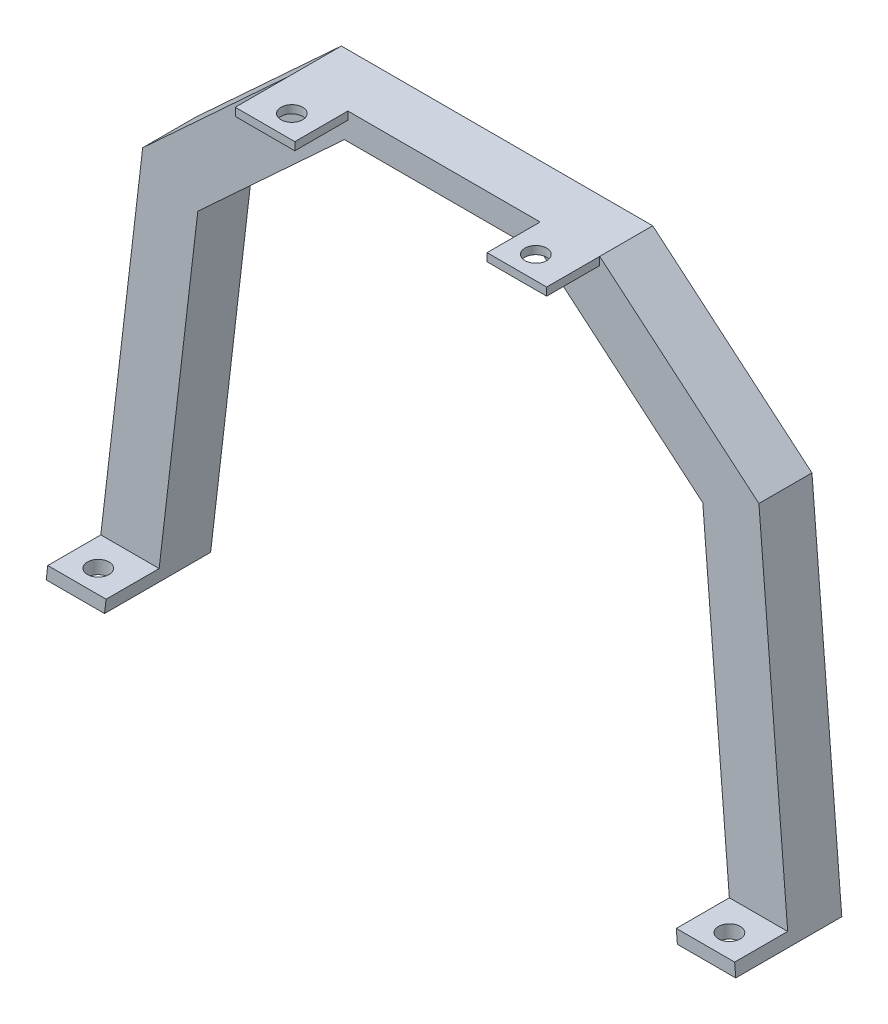
ISO-10303-21;
HEADER;
FILE_DESCRIPTION(('STEP AP214'),'2;1');
FILE_NAME('part.step','',(''),(''),'','','');
FILE_SCHEMA(('AUTOMOTIVE_DESIGN { 1 0 10303 214 1 1 1 1 }'));
ENDSEC;
DATA;
#1=APPLICATION_CONTEXT('core data for automotive mechanical design processes');
#2=APPLICATION_PROTOCOL_DEFINITION('international standard','automotive_design',2000,#1);
#3=PRODUCT_CONTEXT('',#1,'mechanical');
#4=PRODUCT('Part','Part','',(#3));
#5=PRODUCT_RELATED_PRODUCT_CATEGORY('part','',(#4));
#6=PRODUCT_DEFINITION_FORMATION('','',#4);
#7=PRODUCT_DEFINITION_CONTEXT('part definition',#1,'design');
#8=PRODUCT_DEFINITION('design','',#6,#7);
#9=PRODUCT_DEFINITION_SHAPE('','',#8);
#10=(LENGTH_UNIT() NAMED_UNIT(*) SI_UNIT(.MILLI.,.METRE.));
#11=(NAMED_UNIT(*) PLANE_ANGLE_UNIT() SI_UNIT($,.RADIAN.));
#12=(NAMED_UNIT(*) SI_UNIT($,.STERADIAN.) SOLID_ANGLE_UNIT());
#13=UNCERTAINTY_MEASURE_WITH_UNIT(LENGTH_MEASURE(1.E-05),#10,'distance_accuracy_value','');
#14=(GEOMETRIC_REPRESENTATION_CONTEXT(3) GLOBAL_UNCERTAINTY_ASSIGNED_CONTEXT((#13)) GLOBAL_UNIT_ASSIGNED_CONTEXT((#10,
#11,#12)) REPRESENTATION_CONTEXT('',''));
#15=CARTESIAN_POINT('',(0.,0.,0.));
#16=DIRECTION('',(0.,0.,1.));
#17=DIRECTION('',(1.,0.,0.));
#18=AXIS2_PLACEMENT_3D('',#15,#16,#17);
#19=CARTESIAN_POINT('',(24.6463473106537,95.,10.));
#20=DIRECTION('',(0.,-1.,0.));
#21=DIRECTION('',(1.,0.,0.));
#22=AXIS2_PLACEMENT_3D('',#19,#20,#21);
#23=PLANE('',#22);
#24=DIRECTION('',(-1.,0.,0.));
#25=VECTOR('',#24,1.);
#26=CARTESIAN_POINT('',(24.6463473106537,95.,0.));
#27=LINE('',#26,#25);
#28=CARTESIAN_POINT('',(83.3536526893463,95.,0.));
#29=VERTEX_POINT('',#28);
#30=CARTESIAN_POINT('',(24.6463473106537,95.,0.));
#31=VERTEX_POINT('',#30);
#32=EDGE_CURVE('E343',#29,#31,#27,.T.);
#33=ORIENTED_EDGE('',*,*,#32,.T.);
#34=DIRECTION('',(0.,0.,-1.));
#35=VECTOR('',#34,1.);
#36=CARTESIAN_POINT('',(24.6463473106537,95.,10.));
#37=LINE('',#36,#35);
#38=CARTESIAN_POINT('',(24.6463473106537,95.,10.));
#39=VERTEX_POINT('',#38);
#40=EDGE_CURVE('E358',#39,#31,#37,.T.);
#41=ORIENTED_EDGE('',*,*,#40,.F.);
#42=DIRECTION('',(0.,0.,-1.));
#43=VECTOR('',#42,1.);
#44=CARTESIAN_POINT('',(24.6463473106537,95.,20.));
#45=LINE('',#44,#43);
#46=CARTESIAN_POINT('',(24.6463473106537,95.,20.));
#47=VERTEX_POINT('',#46);
#48=EDGE_CURVE('E242',#47,#39,#45,.T.);
#49=ORIENTED_EDGE('',*,*,#48,.F.);
#50=DIRECTION('',(1.,0.,0.));
#51=VECTOR('',#50,1.);
#52=CARTESIAN_POINT('',(24.6463473106537,95.,20.));
#53=LINE('',#52,#51);
#54=CARTESIAN_POINT('',(35.8757637474542,95.,20.));
#55=VERTEX_POINT('',#54);
#56=EDGE_CURVE('E240',#47,#55,#53,.T.);
#57=ORIENTED_EDGE('',*,*,#56,.T.);
#58=DIRECTION('',(0.,0.,-1.));
#59=VECTOR('',#58,1.);
#60=CARTESIAN_POINT('',(35.8757637474542,95.,20.));
#61=LINE('',#60,#59);
#62=CARTESIAN_POINT('',(35.8757637474542,95.,10.));
#63=VERTEX_POINT('',#62);
#64=EDGE_CURVE('E197',#55,#63,#61,.T.);
#65=ORIENTED_EDGE('',*,*,#64,.T.);
#66=DIRECTION('',(-1.,0.,0.));
#67=VECTOR('',#66,1.);
#68=CARTESIAN_POINT('',(24.6463473106537,95.,10.));
#69=LINE('',#68,#67);
#70=CARTESIAN_POINT('',(72.1242362525458,95.,10.));
#71=VERTEX_POINT('',#70);
#72=EDGE_CURVE('E190',#71,#63,#69,.T.);
#73=ORIENTED_EDGE('',*,*,#72,.F.);
#74=DIRECTION('',(0.,0.,-1.));
#75=VECTOR('',#74,1.);
#76=CARTESIAN_POINT('',(72.1242362525458,95.,20.));
#77=LINE('',#76,#75);
#78=CARTESIAN_POINT('',(72.1242362525458,95.,20.));
#79=VERTEX_POINT('',#78);
#80=EDGE_CURVE('E194',#79,#71,#77,.T.);
#81=ORIENTED_EDGE('',*,*,#80,.F.);
#82=DIRECTION('',(-1.,0.,0.));
#83=VECTOR('',#82,1.);
#84=CARTESIAN_POINT('',(83.3536526893463,95.,20.));
#85=LINE('',#84,#83);
#86=CARTESIAN_POINT('',(83.3536526893463,95.,20.));
#87=VERTEX_POINT('',#86);
#88=EDGE_CURVE('E223',#87,#79,#85,.T.);
#89=ORIENTED_EDGE('',*,*,#88,.F.);
#90=DIRECTION('',(0.,0.,-1.));
#91=VECTOR('',#90,1.);
#92=CARTESIAN_POINT('',(83.3536526893463,95.,20.));
#93=LINE('',#92,#91);
#94=CARTESIAN_POINT('',(83.3536526893463,95.,10.));
#95=VERTEX_POINT('',#94);
#96=EDGE_CURVE('E212',#87,#95,#93,.T.);
#97=ORIENTED_EDGE('',*,*,#96,.T.);
#98=DIRECTION('',(0.,0.,-1.));
#99=VECTOR('',#98,1.);
#100=CARTESIAN_POINT('',(83.3536526893463,95.,10.));
#101=LINE('',#100,#99);
#102=EDGE_CURVE('E361',#95,#29,#101,.T.);
#103=ORIENTED_EDGE('',*,*,#102,.T.);
#104=EDGE_LOOP('',(#33,#41,#49,#57,#65,#73,#81,#89,#97,#103));
#105=FACE_BOUND('',#104,.T.);
#106=CARTESIAN_POINT('',(77.,95.,15.6873727087576));
#107=DIRECTION('',(0.,1.,0.));
#108=DIRECTION('',(0.,0.,1.));
#109=AXIS2_PLACEMENT_3D('',#106,#107,#108);
#110=CIRCLE('',#109,2.04999999999999);
#111=CARTESIAN_POINT('',(77.,95.,17.7373727087576));
#112=VERTEX_POINT('',#111);
#113=EDGE_CURVE('E387',#112,#112,#110,.F.);
#114=ORIENTED_EDGE('',*,*,#113,.T.);
#115=EDGE_LOOP('',(#114));
#116=FACE_BOUND('',#115,.T.);
#117=CARTESIAN_POINT('',(31.,95.,15.6873727087576));
#118=DIRECTION('',(0.,1.,0.));
#119=DIRECTION('',(0.,0.,1.));
#120=AXIS2_PLACEMENT_3D('',#117,#118,#119);
#121=CIRCLE('',#120,2.05);
#122=CARTESIAN_POINT('',(31.,95.,17.7373727087576));
#123=VERTEX_POINT('',#122);
#124=EDGE_CURVE('E382',#123,#123,#121,.T.);
#125=ORIENTED_EDGE('',*,*,#124,.F.);
#126=EDGE_LOOP('',(#125));
#127=FACE_BOUND('',#126,.T.);
#128=ADVANCED_FACE('F33',(#105,#116,#127),#23,.F.);
#129=CARTESIAN_POINT('',(0.,0.,10.));
#130=DIRECTION('',(0.,0.,-1.));
#131=DIRECTION('',(-1.,0.,0.));
#132=AXIS2_PLACEMENT_3D('',#129,#130,#131);
#133=PLANE('',#132);
#134=DIRECTION('',(-0.764196921107541,0.644982996496617,0.));
#135=VECTOR('',#134,1.);
#136=CARTESIAN_POINT('',(83.3536526893463,95.,10.));
#137=LINE('',#136,#135);
#138=CARTESIAN_POINT('',(113.374131029102,69.6626850474936,10.));
#139=VERTEX_POINT('',#138);
#140=EDGE_CURVE('E200',#139,#95,#137,.T.);
#141=ORIENTED_EDGE('',*,*,#140,.T.);
#142=DIRECTION('',(0.,-1.,0.));
#143=VECTOR('',#142,1.);
#144=CARTESIAN_POINT('',(83.3536526893463,95.,10.));
#145=LINE('',#144,#143);
#146=CARTESIAN_POINT('',(83.3536526893463,93.5,10.));
#147=VERTEX_POINT('',#146);
#148=EDGE_CURVE('E55',#95,#147,#145,.T.);
#149=ORIENTED_EDGE('',*,*,#148,.T.);
#150=DIRECTION('',(-1.,0.,0.));
#151=VECTOR('',#150,1.);
#152=CARTESIAN_POINT('',(83.3536526893463,93.5,10.));
#153=LINE('',#152,#151);
#154=CARTESIAN_POINT('',(72.1242362525458,93.5,10.));
#155=VERTEX_POINT('',#154);
#156=EDGE_CURVE('E50',#147,#155,#153,.T.);
#157=ORIENTED_EDGE('',*,*,#156,.T.);
#158=DIRECTION('',(0.,-1.,0.));
#159=VECTOR('',#158,1.);
#160=CARTESIAN_POINT('',(72.1242362525458,95.,10.));
#161=LINE('',#160,#159);
#162=EDGE_CURVE('E203',#71,#155,#161,.T.);
#163=ORIENTED_EDGE('',*,*,#162,.F.);
#164=ORIENTED_EDGE('',*,*,#72,.T.);
#165=DIRECTION('',(0.,-1.,0.));
#166=VECTOR('',#165,1.);
#167=CARTESIAN_POINT('',(35.8757637474542,95.,10.));
#168=LINE('',#167,#166);
#169=CARTESIAN_POINT('',(35.8757637474542,93.5,10.));
#170=VERTEX_POINT('',#169);
#171=EDGE_CURVE('E235',#63,#170,#168,.T.);
#172=ORIENTED_EDGE('',*,*,#171,.T.);
#173=DIRECTION('',(1.,0.,0.));
#174=VECTOR('',#173,1.);
#175=CARTESIAN_POINT('',(24.6463473106537,93.5,10.));
#176=LINE('',#175,#174);
#177=CARTESIAN_POINT('',(24.6463473106537,93.5,10.));
#178=VERTEX_POINT('',#177);
#179=EDGE_CURVE('E245',#178,#170,#176,.T.);
#180=ORIENTED_EDGE('',*,*,#179,.F.);
#181=DIRECTION('',(0.,-1.,0.));
#182=VECTOR('',#181,1.);
#183=CARTESIAN_POINT('',(24.6463473106537,95.,10.));
#184=LINE('',#183,#182);
#185=EDGE_CURVE('E222',#39,#178,#184,.T.);
#186=ORIENTED_EDGE('',*,*,#185,.F.);
#187=DIRECTION('',(-0.734909493731991,-0.678165198180052,0.));
#188=VECTOR('',#187,1.);
#189=CARTESIAN_POINT('',(-2.81102348077808,69.6626850474936,10.));
#190=LINE('',#189,#188);
#191=CARTESIAN_POINT('',(-2.81102348077808,69.6626850474936,10.));
#192=VERTEX_POINT('',#191);
#193=EDGE_CURVE('E199',#39,#192,#190,.T.);
#194=ORIENTED_EDGE('',*,*,#193,.T.);
#195=DIRECTION('',(-0.116747966359497,-0.993161574141349,0.));
#196=VECTOR('',#195,1.);
#197=CARTESIAN_POINT('',(-11.,0.,10.));
#198=LINE('',#197,#196);
#199=CARTESIAN_POINT('',(-10.7061204103158,2.5,10.));
#200=VERTEX_POINT('',#199);
#201=EDGE_CURVE('E324',#192,#200,#198,.T.);
#202=ORIENTED_EDGE('',*,*,#201,.T.);
#203=DIRECTION('',(-1.,0.,0.));
#204=VECTOR('',#203,1.);
#205=CARTESIAN_POINT('',(0.293879589684168,2.5,10.));
#206=LINE('',#205,#204);
#207=CARTESIAN_POINT('',(0.293879589684168,2.5,10.));
#208=VERTEX_POINT('',#207);
#209=EDGE_CURVE('E289',#208,#200,#206,.T.);
#210=ORIENTED_EDGE('',*,*,#209,.F.);
#211=DIRECTION('',(0.116747966359497,0.993161574141349,0.));
#212=VECTOR('',#211,1.);
#213=CARTESIAN_POINT('',(0.,0.,10.));
#214=LINE('',#213,#212);
#215=CARTESIAN_POINT('',(7.58105622800968,64.4911767788726,10.));
#216=VERTEX_POINT('',#215);
#217=EDGE_CURVE('E309',#208,#216,#214,.T.);
#218=ORIENTED_EDGE('',*,*,#217,.T.);
#219=DIRECTION('',(0.734909493731991,0.678165198180051,0.));
#220=VECTOR('',#219,1.);
#221=CARTESIAN_POINT('',(7.58105622800968,64.4911767788726,10.));
#222=LINE('',#221,#220);
#223=CARTESIAN_POINT('',(35.2242859446729,90.,10.));
#224=VERTEX_POINT('',#223);
#225=EDGE_CURVE('E311',#216,#224,#222,.T.);
#226=ORIENTED_EDGE('',*,*,#225,.T.);
#227=DIRECTION('',(1.,0.,0.));
#228=VECTOR('',#227,1.);
#229=CARTESIAN_POINT('',(35.2242859446729,90.,10.));
#230=LINE('',#229,#228);
#231=CARTESIAN_POINT('',(72.5680884563473,90.,10.));
#232=VERTEX_POINT('',#231);
#233=EDGE_CURVE('E314',#224,#232,#230,.T.);
#234=ORIENTED_EDGE('',*,*,#233,.T.);
#235=DIRECTION('',(0.764196921107541,-0.644982996496617,0.));
#236=VECTOR('',#235,1.);
#237=CARTESIAN_POINT('',(72.5680884563473,90.,10.));
#238=LINE('',#237,#236);
#239=CARTESIAN_POINT('',(102.791775394681,64.4911767788726,10.));
#240=VERTEX_POINT('',#239);
#241=EDGE_CURVE('E316',#232,#240,#238,.T.);
#242=ORIENTED_EDGE('',*,*,#241,.T.);
#243=DIRECTION('',(0.0804966438748155,-0.996754879759759,0.));
#244=VECTOR('',#243,1.);
#245=CARTESIAN_POINT('',(102.791775394681,64.4911767788726,10.));
#246=LINE('',#245,#244);
#247=CARTESIAN_POINT('',(107.798103210956,2.5,10.));
#248=VERTEX_POINT('',#247);
#249=EDGE_CURVE('E318',#240,#248,#246,.T.);
#250=ORIENTED_EDGE('',*,*,#249,.T.);
#251=DIRECTION('',(-1.,0.,0.));
#252=VECTOR('',#251,1.);
#253=CARTESIAN_POINT('',(118.798103210956,2.5,10.));
#254=LINE('',#253,#252);
#255=CARTESIAN_POINT('',(118.798103210956,2.5,10.));
#256=VERTEX_POINT('',#255);
#257=EDGE_CURVE('E270',#256,#248,#254,.T.);
#258=ORIENTED_EDGE('',*,*,#257,.F.);
#259=DIRECTION('',(-0.0804966438748154,0.996754879759759,0.));
#260=VECTOR('',#259,1.);
#261=CARTESIAN_POINT('',(113.374131029102,69.6626850474936,10.));
#262=LINE('',#261,#260);
#263=EDGE_CURVE('E320',#256,#139,#262,.T.);
#264=ORIENTED_EDGE('',*,*,#263,.T.);
#265=EDGE_LOOP('',(#141,#149,#157,#163,#164,#172,#180,#186,#194,#202,#210,#218,#226,#234,#242,
#250,#258,#264));
#266=FACE_BOUND('',#265,.T.);
#267=ADVANCED_FACE('F204',(#266),#133,.F.);
#268=CARTESIAN_POINT('',(0.,0.,10.));
#269=DIRECTION('',(-0.993161574141349,0.116747966359497,0.));
#270=DIRECTION('',(-0.116747966359497,-0.993161574141349,0.));
#271=AXIS2_PLACEMENT_3D('',#268,#269,#270);
#272=PLANE('',#271);
#273=DIRECTION('',(0.116747966359497,0.993161574141349,0.));
#274=VECTOR('',#273,1.);
#275=CARTESIAN_POINT('',(0.,0.,0.));
#276=LINE('',#275,#274);
#277=CARTESIAN_POINT('',(0.,0.,0.));
#278=VERTEX_POINT('',#277);
#279=CARTESIAN_POINT('',(7.58105622800968,64.4911767788726,0.));
#280=VERTEX_POINT('',#279);
#281=EDGE_CURVE('E308',#278,#280,#276,.T.);
#282=ORIENTED_EDGE('',*,*,#281,.T.);
#283=DIRECTION('',(0.,0.,-1.));
#284=VECTOR('',#283,1.);
#285=CARTESIAN_POINT('',(7.58105622800968,64.4911767788726,10.));
#286=LINE('',#285,#284);
#287=EDGE_CURVE('E11',#216,#280,#286,.T.);
#288=ORIENTED_EDGE('',*,*,#287,.F.);
#289=ORIENTED_EDGE('',*,*,#217,.F.);
#290=DIRECTION('',(0.,0.,-1.));
#291=VECTOR('',#290,1.);
#292=CARTESIAN_POINT('',(0.293879589684168,2.5,20.));
#293=LINE('',#292,#291);
#294=CARTESIAN_POINT('',(0.293879589684168,2.5,20.));
#295=VERTEX_POINT('',#294);
#296=EDGE_CURVE('E305',#295,#208,#293,.T.);
#297=ORIENTED_EDGE('',*,*,#296,.F.);
#298=DIRECTION('',(0.116747966359497,0.993161574141349,0.));
#299=VECTOR('',#298,1.);
#300=CARTESIAN_POINT('',(0.,0.,20.));
#301=LINE('',#300,#299);
#302=CARTESIAN_POINT('',(0.,0.,20.));
#303=VERTEX_POINT('',#302);
#304=EDGE_CURVE('E296',#303,#295,#301,.T.);
#305=ORIENTED_EDGE('',*,*,#304,.F.);
#306=DIRECTION('',(0.,0.,-1.));
#307=VECTOR('',#306,1.);
#308=CARTESIAN_POINT('',(0.,0.,10.));
#309=LINE('',#308,#307);
#310=EDGE_CURVE('E326',#303,#278,#309,.T.);
#311=ORIENTED_EDGE('',*,*,#310,.T.);
#312=EDGE_LOOP('',(#282,#288,#289,#297,#305,#311));
#313=FACE_BOUND('',#312,.T.);
#314=ADVANCED_FACE('F35',(#313),#272,.F.);
#315=CARTESIAN_POINT('',(7.58105622800968,64.4911767788726,10.));
#316=DIRECTION('',(-0.678165198180051,0.734909493731991,0.));
#317=DIRECTION('',(-0.734909493731991,-0.678165198180051,0.));
#318=AXIS2_PLACEMENT_3D('',#315,#316,#317);
#319=PLANE('',#318);
#320=DIRECTION('',(0.734909493731991,0.678165198180051,0.));
#321=VECTOR('',#320,1.);
#322=CARTESIAN_POINT('',(7.58105622800968,64.4911767788726,0.));
#323=LINE('',#322,#321);
#324=CARTESIAN_POINT('',(35.2242859446729,90.,0.));
#325=VERTEX_POINT('',#324);
#326=EDGE_CURVE('E329',#280,#325,#323,.T.);
#327=ORIENTED_EDGE('',*,*,#326,.T.);
#328=DIRECTION('',(0.,0.,-1.));
#329=VECTOR('',#328,1.);
#330=CARTESIAN_POINT('',(35.2242859446729,90.,10.));
#331=LINE('',#330,#329);
#332=EDGE_CURVE('E42',#224,#325,#331,.T.);
#333=ORIENTED_EDGE('',*,*,#332,.F.);
#334=ORIENTED_EDGE('',*,*,#225,.F.);
#335=ORIENTED_EDGE('',*,*,#287,.T.);
#336=EDGE_LOOP('',(#327,#333,#334,#335));
#337=FACE_BOUND('',#336,.T.);
#338=ADVANCED_FACE('F434',(#337),#319,.F.);
#339=CARTESIAN_POINT('',(35.2242859446729,90.,10.));
#340=DIRECTION('',(0.,1.,0.));
#341=DIRECTION('',(0.,0.,1.));
#342=AXIS2_PLACEMENT_3D('',#339,#340,#341);
#343=PLANE('',#342);
#344=DIRECTION('',(1.,0.,0.));
#345=VECTOR('',#344,1.);
#346=CARTESIAN_POINT('',(35.2242859446729,90.,0.));
#347=LINE('',#346,#345);
#348=CARTESIAN_POINT('',(72.5680884563473,90.,0.));
#349=VERTEX_POINT('',#348);
#350=EDGE_CURVE('E331',#325,#349,#347,.T.);
#351=ORIENTED_EDGE('',*,*,#350,.T.);
#352=DIRECTION('',(0.,0.,-1.));
#353=VECTOR('',#352,1.);
#354=CARTESIAN_POINT('',(72.5680884563473,90.,10.));
#355=LINE('',#354,#353);
#356=EDGE_CURVE('E376',#232,#349,#355,.T.);
#357=ORIENTED_EDGE('',*,*,#356,.F.);
#358=ORIENTED_EDGE('',*,*,#233,.F.);
#359=ORIENTED_EDGE('',*,*,#332,.T.);
#360=EDGE_LOOP('',(#351,#357,#358,#359));
#361=FACE_BOUND('',#360,.T.);
#362=ADVANCED_FACE('F439',(#361),#343,.F.);
#363=CARTESIAN_POINT('',(72.5680884563473,90.,10.));
#364=DIRECTION('',(0.644982996496617,0.764196921107541,0.));
#365=DIRECTION('',(-0.764196921107541,0.644982996496617,0.));
#366=AXIS2_PLACEMENT_3D('',#363,#364,#365);
#367=PLANE('',#366);
#368=DIRECTION('',(0.764196921107541,-0.644982996496617,0.));
#369=VECTOR('',#368,1.);
#370=CARTESIAN_POINT('',(72.5680884563473,90.,0.));
#371=LINE('',#370,#369);
#372=CARTESIAN_POINT('',(102.791775394681,64.4911767788726,0.));
#373=VERTEX_POINT('',#372);
#374=EDGE_CURVE('E333',#349,#373,#371,.T.);
#375=ORIENTED_EDGE('',*,*,#374,.T.);
#376=DIRECTION('',(0.,0.,-1.));
#377=VECTOR('',#376,1.);
#378=CARTESIAN_POINT('',(102.791775394681,64.4911767788726,10.));
#379=LINE('',#378,#377);
#380=EDGE_CURVE('E373',#240,#373,#379,.T.);
#381=ORIENTED_EDGE('',*,*,#380,.F.);
#382=ORIENTED_EDGE('',*,*,#241,.F.);
#383=ORIENTED_EDGE('',*,*,#356,.T.);
#384=EDGE_LOOP('',(#375,#381,#382,#383));
#385=FACE_BOUND('',#384,.T.);
#386=ADVANCED_FACE('F445',(#385),#367,.F.);
#387=CARTESIAN_POINT('',(102.791775394681,64.4911767788726,10.));
#388=DIRECTION('',(0.996754879759759,0.0804966438748155,0.));
#389=DIRECTION('',(-0.0804966438748155,0.996754879759759,0.));
#390=AXIS2_PLACEMENT_3D('',#387,#388,#389);
#391=PLANE('',#390);
#392=DIRECTION('',(0.0804966438748155,-0.996754879759759,0.));
#393=VECTOR('',#392,1.);
#394=CARTESIAN_POINT('',(102.791775394681,64.4911767788726,0.));
#395=LINE('',#394,#393);
#396=CARTESIAN_POINT('',(108.,0.,0.));
#397=VERTEX_POINT('',#396);
#398=EDGE_CURVE('E335',#373,#397,#395,.T.);
#399=ORIENTED_EDGE('',*,*,#398,.T.);
#400=DIRECTION('',(0.,0.,-1.));
#401=VECTOR('',#400,1.);
#402=CARTESIAN_POINT('',(108.,0.,10.));
#403=LINE('',#402,#401);
#404=CARTESIAN_POINT('',(108.,0.,20.));
#405=VERTEX_POINT('',#404);
#406=EDGE_CURVE('E370',#405,#397,#403,.T.);
#407=ORIENTED_EDGE('',*,*,#406,.F.);
#408=DIRECTION('',(0.080496643874815,-0.996754879759759,0.));
#409=VECTOR('',#408,1.);
#410=CARTESIAN_POINT('',(107.798103210956,2.5,20.));
#411=LINE('',#410,#409);
#412=CARTESIAN_POINT('',(107.798103210956,2.5,20.));
#413=VERTEX_POINT('',#412);
#414=EDGE_CURVE('E271',#413,#405,#411,.T.);
#415=ORIENTED_EDGE('',*,*,#414,.F.);
#416=DIRECTION('',(0.,0.,-1.));
#417=VECTOR('',#416,1.);
#418=CARTESIAN_POINT('',(107.798103210956,2.5,20.));
#419=LINE('',#418,#417);
#420=EDGE_CURVE('E281',#413,#248,#419,.T.);
#421=ORIENTED_EDGE('',*,*,#420,.T.);
#422=ORIENTED_EDGE('',*,*,#249,.F.);
#423=ORIENTED_EDGE('',*,*,#380,.T.);
#424=EDGE_LOOP('',(#399,#407,#415,#421,#422,#423));
#425=FACE_BOUND('',#424,.T.);
#426=ADVANCED_FACE('F449',(#425),#391,.F.);
#427=CARTESIAN_POINT('',(108.,0.,10.));
#428=DIRECTION('',(0.,1.,0.));
#429=DIRECTION('',(-1.,0.,0.));
#430=AXIS2_PLACEMENT_3D('',#427,#428,#429);
#431=PLANE('',#430);
#432=CARTESIAN_POINT('',(113.5,0.,15.6873727087576));
#433=DIRECTION('',(0.,1.,0.));
#434=DIRECTION('',(-1.,0.,0.));
#435=AXIS2_PLACEMENT_3D('',#432,#433,#434);
#436=CIRCLE('',#435,2.04999999999999);
#437=CARTESIAN_POINT('',(111.45,0.,15.6873727087576));
#438=VERTEX_POINT('',#437);
#439=EDGE_CURVE('E262',#438,#438,#436,.T.);
#440=ORIENTED_EDGE('',*,*,#439,.T.);
#441=EDGE_LOOP('',(#440));
#442=FACE_BOUND('',#441,.T.);
#443=DIRECTION('',(1.,0.,0.));
#444=VECTOR('',#443,1.);
#445=CARTESIAN_POINT('',(108.,0.,0.));
#446=LINE('',#445,#444);
#447=CARTESIAN_POINT('',(119.,0.,0.));
#448=VERTEX_POINT('',#447);
#449=EDGE_CURVE('E337',#397,#448,#446,.T.);
#450=ORIENTED_EDGE('',*,*,#449,.T.);
#451=DIRECTION('',(0.,0.,-1.));
#452=VECTOR('',#451,1.);
#453=CARTESIAN_POINT('',(119.,0.,10.));
#454=LINE('',#453,#452);
#455=CARTESIAN_POINT('',(119.,0.,20.));
#456=VERTEX_POINT('',#455);
#457=EDGE_CURVE('E367',#456,#448,#454,.T.);
#458=ORIENTED_EDGE('',*,*,#457,.F.);
#459=DIRECTION('',(1.,0.,0.));
#460=VECTOR('',#459,1.);
#461=CARTESIAN_POINT('',(108.,0.,20.));
#462=LINE('',#461,#460);
#463=EDGE_CURVE('E274',#405,#456,#462,.T.);
#464=ORIENTED_EDGE('',*,*,#463,.F.);
#465=ORIENTED_EDGE('',*,*,#406,.T.);
#466=EDGE_LOOP('',(#450,#458,#464,#465));
#467=FACE_BOUND('',#466,.T.);
#468=ADVANCED_FACE('F467',(#442,#467),#431,.F.);
#469=CARTESIAN_POINT('',(113.374131029102,69.6626850474936,10.));
#470=DIRECTION('',(-0.996754879759759,-0.0804966438748154,0.));
#471=DIRECTION('',(0.0804966438748154,-0.996754879759759,0.));
#472=AXIS2_PLACEMENT_3D('',#469,#470,#471);
#473=PLANE('',#472);
#474=DIRECTION('',(-0.0804966438748154,0.996754879759759,0.));
#475=VECTOR('',#474,1.);
#476=CARTESIAN_POINT('',(113.374131029102,69.6626850474936,0.));
#477=LINE('',#476,#475);
#478=CARTESIAN_POINT('',(113.374131029102,69.6626850474936,0.));
#479=VERTEX_POINT('',#478);
#480=EDGE_CURVE('E339',#448,#479,#477,.T.);
#481=ORIENTED_EDGE('',*,*,#480,.T.);
#482=DIRECTION('',(0.,0.,-1.));
#483=VECTOR('',#482,1.);
#484=CARTESIAN_POINT('',(113.374131029102,69.6626850474936,10.));
#485=LINE('',#484,#483);
#486=EDGE_CURVE('E364',#139,#479,#485,.T.);
#487=ORIENTED_EDGE('',*,*,#486,.F.);
#488=ORIENTED_EDGE('',*,*,#263,.F.);
#489=DIRECTION('',(0.,0.,-1.));
#490=VECTOR('',#489,1.);
#491=CARTESIAN_POINT('',(118.798103210956,2.5,20.));
#492=LINE('',#491,#490);
#493=CARTESIAN_POINT('',(118.798103210956,2.5,20.));
#494=VERTEX_POINT('',#493);
#495=EDGE_CURVE('E286',#494,#256,#492,.T.);
#496=ORIENTED_EDGE('',*,*,#495,.F.);
#497=DIRECTION('',(-0.0804966438748149,0.996754879759759,0.));
#498=VECTOR('',#497,1.);
#499=CARTESIAN_POINT('',(119.,0.,20.));
#500=LINE('',#499,#498);
#501=EDGE_CURVE('E277',#456,#494,#500,.T.);
#502=ORIENTED_EDGE('',*,*,#501,.F.);
#503=ORIENTED_EDGE('',*,*,#457,.T.);
#504=EDGE_LOOP('',(#481,#487,#488,#496,#502,#503));
#505=FACE_BOUND('',#504,.T.);
#506=ADVANCED_FACE('F458',(#505),#473,.F.);
#507=CARTESIAN_POINT('',(83.3536526893463,95.,10.));
#508=DIRECTION('',(-0.644982996496617,-0.764196921107541,0.));
#509=DIRECTION('',(0.764196921107541,-0.644982996496617,0.));
#510=AXIS2_PLACEMENT_3D('',#507,#508,#509);
#511=PLANE('',#510);
#512=DIRECTION('',(-0.764196921107541,0.644982996496617,0.));
#513=VECTOR('',#512,1.);
#514=CARTESIAN_POINT('',(83.3536526893463,95.,0.));
#515=LINE('',#514,#513);
#516=EDGE_CURVE('E341',#479,#29,#515,.T.);
#517=ORIENTED_EDGE('',*,*,#516,.T.);
#518=ORIENTED_EDGE('',*,*,#102,.F.);
#519=ORIENTED_EDGE('',*,*,#140,.F.);
#520=ORIENTED_EDGE('',*,*,#486,.T.);
#521=EDGE_LOOP('',(#517,#518,#519,#520));
#522=FACE_BOUND('',#521,.T.);
#523=ADVANCED_FACE('F459',(#522),#511,.F.);
#524=CARTESIAN_POINT('',(-2.81102348077808,69.6626850474936,10.));
#525=DIRECTION('',(0.678165198180052,-0.734909493731991,0.));
#526=DIRECTION('',(0.734909493731991,0.678165198180052,0.));
#527=AXIS2_PLACEMENT_3D('',#524,#525,#526);
#528=PLANE('',#527);
#529=DIRECTION('',(-0.734909493731991,-0.678165198180052,0.));
#530=VECTOR('',#529,1.);
#531=CARTESIAN_POINT('',(-2.81102348077808,69.6626850474936,0.));
#532=LINE('',#531,#530);
#533=CARTESIAN_POINT('',(-2.81102348077808,69.6626850474936,0.));
#534=VERTEX_POINT('',#533);
#535=EDGE_CURVE('E345',#31,#534,#532,.T.);
#536=ORIENTED_EDGE('',*,*,#535,.T.);
#537=DIRECTION('',(0.,0.,-1.));
#538=VECTOR('',#537,1.);
#539=CARTESIAN_POINT('',(-2.81102348077808,69.6626850474936,10.));
#540=LINE('',#539,#538);
#541=EDGE_CURVE('E355',#192,#534,#540,.T.);
#542=ORIENTED_EDGE('',*,*,#541,.F.);
#543=ORIENTED_EDGE('',*,*,#193,.F.);
#544=ORIENTED_EDGE('',*,*,#40,.T.);
#545=EDGE_LOOP('',(#536,#542,#543,#544));
#546=FACE_BOUND('',#545,.T.);
#547=ADVANCED_FACE('F416',(#546),#528,.F.);
#548=CARTESIAN_POINT('',(-11.,0.,10.));
#549=DIRECTION('',(0.993161574141349,-0.116747966359497,0.));
#550=DIRECTION('',(0.116747966359497,0.993161574141349,0.));
#551=AXIS2_PLACEMENT_3D('',#548,#549,#550);
#552=PLANE('',#551);
#553=DIRECTION('',(-0.116747966359497,-0.993161574141349,0.));
#554=VECTOR('',#553,1.);
#555=CARTESIAN_POINT('',(-11.,0.,0.));
#556=LINE('',#555,#554);
#557=CARTESIAN_POINT('',(-11.,0.,0.));
#558=VERTEX_POINT('',#557);
#559=EDGE_CURVE('E347',#534,#558,#556,.T.);
#560=ORIENTED_EDGE('',*,*,#559,.T.);
#561=DIRECTION('',(0.,0.,-1.));
#562=VECTOR('',#561,1.);
#563=CARTESIAN_POINT('',(-11.,0.,10.));
#564=LINE('',#563,#562);
#565=CARTESIAN_POINT('',(-11.,0.,20.));
#566=VERTEX_POINT('',#565);
#567=EDGE_CURVE('E352',#566,#558,#564,.T.);
#568=ORIENTED_EDGE('',*,*,#567,.F.);
#569=DIRECTION('',(-0.116747966359497,-0.993161574141349,0.));
#570=VECTOR('',#569,1.);
#571=CARTESIAN_POINT('',(-10.7061204103158,2.5,20.));
#572=LINE('',#571,#570);
#573=CARTESIAN_POINT('',(-10.7061204103158,2.5,20.));
#574=VERTEX_POINT('',#573);
#575=EDGE_CURVE('E290',#574,#566,#572,.T.);
#576=ORIENTED_EDGE('',*,*,#575,.F.);
#577=DIRECTION('',(0.,0.,-1.));
#578=VECTOR('',#577,1.);
#579=CARTESIAN_POINT('',(-10.7061204103158,2.5,20.));
#580=LINE('',#579,#578);
#581=EDGE_CURVE('E300',#574,#200,#580,.T.);
#582=ORIENTED_EDGE('',*,*,#581,.T.);
#583=ORIENTED_EDGE('',*,*,#201,.F.);
#584=ORIENTED_EDGE('',*,*,#541,.T.);
#585=EDGE_LOOP('',(#560,#568,#576,#582,#583,#584));
#586=FACE_BOUND('',#585,.T.);
#587=ADVANCED_FACE('F419',(#586),#552,.F.);
#588=CARTESIAN_POINT('',(0.,0.,10.));
#589=DIRECTION('',(0.,1.,0.));
#590=DIRECTION('',(-1.,0.,0.));
#591=AXIS2_PLACEMENT_3D('',#588,#589,#590);
#592=PLANE('',#591);
#593=CARTESIAN_POINT('',(-5.5,0.,15.6873727087576));
#594=DIRECTION('',(0.,1.,0.));
#595=DIRECTION('',(-1.,0.,0.));
#596=AXIS2_PLACEMENT_3D('',#593,#594,#595);
#597=CIRCLE('',#596,2.05);
#598=CARTESIAN_POINT('',(-7.55,0.,15.6873727087576));
#599=VERTEX_POINT('',#598);
#600=EDGE_CURVE('E267',#599,#599,#597,.T.);
#601=ORIENTED_EDGE('',*,*,#600,.T.);
#602=EDGE_LOOP('',(#601));
#603=FACE_BOUND('',#602,.T.);
#604=DIRECTION('',(1.,0.,0.));
#605=VECTOR('',#604,1.);
#606=CARTESIAN_POINT('',(0.,0.,0.));
#607=LINE('',#606,#605);
#608=EDGE_CURVE('E312',#558,#278,#607,.T.);
#609=ORIENTED_EDGE('',*,*,#608,.T.);
#610=ORIENTED_EDGE('',*,*,#310,.F.);
#611=DIRECTION('',(1.,0.,0.));
#612=VECTOR('',#611,1.);
#613=CARTESIAN_POINT('',(-11.,0.,20.));
#614=LINE('',#613,#612);
#615=EDGE_CURVE('E293',#566,#303,#614,.T.);
#616=ORIENTED_EDGE('',*,*,#615,.F.);
#617=ORIENTED_EDGE('',*,*,#567,.T.);
#618=EDGE_LOOP('',(#609,#610,#616,#617));
#619=FACE_BOUND('',#618,.T.);
#620=ADVANCED_FACE('F478',(#603,#619),#592,.F.);
#621=CARTESIAN_POINT('',(0.,0.,0.));
#622=DIRECTION('',(0.,0.,-1.));
#623=DIRECTION('',(-1.,0.,0.));
#624=AXIS2_PLACEMENT_3D('',#621,#622,#623);
#625=PLANE('',#624);
#626=ORIENTED_EDGE('',*,*,#281,.F.);
#627=ORIENTED_EDGE('',*,*,#608,.F.);
#628=ORIENTED_EDGE('',*,*,#559,.F.);
#629=ORIENTED_EDGE('',*,*,#535,.F.);
#630=ORIENTED_EDGE('',*,*,#32,.F.);
#631=ORIENTED_EDGE('',*,*,#516,.F.);
#632=ORIENTED_EDGE('',*,*,#480,.F.);
#633=ORIENTED_EDGE('',*,*,#449,.F.);
#634=ORIENTED_EDGE('',*,*,#398,.F.);
#635=ORIENTED_EDGE('',*,*,#374,.F.);
#636=ORIENTED_EDGE('',*,*,#350,.F.);
#637=ORIENTED_EDGE('',*,*,#326,.F.);
#638=EDGE_LOOP('',(#626,#627,#628,#629,#630,#631,#632,#633,#634,#635,#636,#637));
#639=FACE_BOUND('',#638,.T.);
#640=ADVANCED_FACE('F410',(#639),#625,.T.);
#641=CARTESIAN_POINT('',(0.293879589684168,2.5,20.));
#642=DIRECTION('',(0.,-1.,0.));
#643=DIRECTION('',(1.,0.,0.));
#644=AXIS2_PLACEMENT_3D('',#641,#642,#643);
#645=PLANE('',#644);
#646=CARTESIAN_POINT('',(-5.5,2.5,15.6873727087576));
#647=DIRECTION('',(0.,1.,0.));
#648=DIRECTION('',(-1.,0.,0.));
#649=AXIS2_PLACEMENT_3D('',#646,#647,#648);
#650=CIRCLE('',#649,2.05);
#651=CARTESIAN_POINT('',(-7.55,2.5,15.6873727087576));
#652=VERTEX_POINT('',#651);
#653=EDGE_CURVE('E259',#652,#652,#650,.T.);
#654=ORIENTED_EDGE('',*,*,#653,.F.);
#655=EDGE_LOOP('',(#654));
#656=FACE_BOUND('',#655,.T.);
#657=ORIENTED_EDGE('',*,*,#209,.T.);
#658=ORIENTED_EDGE('',*,*,#581,.F.);
#659=DIRECTION('',(-1.,0.,0.));
#660=VECTOR('',#659,1.);
#661=CARTESIAN_POINT('',(0.293879589684168,2.5,20.));
#662=LINE('',#661,#660);
#663=EDGE_CURVE('E298',#295,#574,#662,.T.);
#664=ORIENTED_EDGE('',*,*,#663,.F.);
#665=ORIENTED_EDGE('',*,*,#296,.T.);
#666=EDGE_LOOP('',(#657,#658,#664,#665));
#667=FACE_BOUND('',#666,.T.);
#668=ADVANCED_FACE('F425',(#656,#667),#645,.F.);
#669=CARTESIAN_POINT('',(0.,0.,20.));
#670=DIRECTION('',(0.,0.,1.));
#671=DIRECTION('',(1.,0.,0.));
#672=AXIS2_PLACEMENT_3D('',#669,#670,#671);
#673=PLANE('',#672);
#674=ORIENTED_EDGE('',*,*,#575,.T.);
#675=ORIENTED_EDGE('',*,*,#615,.T.);
#676=ORIENTED_EDGE('',*,*,#304,.T.);
#677=ORIENTED_EDGE('',*,*,#663,.T.);
#678=EDGE_LOOP('',(#674,#675,#676,#677));
#679=FACE_BOUND('',#678,.T.);
#680=ADVANCED_FACE('F486',(#679),#673,.T.);
#681=CARTESIAN_POINT('',(118.798103210956,2.5,20.));
#682=DIRECTION('',(0.,-1.,0.));
#683=DIRECTION('',(1.,0.,0.));
#684=AXIS2_PLACEMENT_3D('',#681,#682,#683);
#685=PLANE('',#684);
#686=CARTESIAN_POINT('',(113.5,2.50000000000002,15.6873727087576));
#687=DIRECTION('',(0.,1.,0.));
#688=DIRECTION('',(-1.,0.,0.));
#689=AXIS2_PLACEMENT_3D('',#686,#687,#688);
#690=CIRCLE('',#689,2.04999999999999);
#691=CARTESIAN_POINT('',(111.45,2.50000000000002,15.6873727087576));
#692=VERTEX_POINT('',#691);
#693=EDGE_CURVE('E258',#692,#692,#690,.T.);
#694=ORIENTED_EDGE('',*,*,#693,.F.);
#695=EDGE_LOOP('',(#694));
#696=FACE_BOUND('',#695,.T.);
#697=ORIENTED_EDGE('',*,*,#257,.T.);
#698=ORIENTED_EDGE('',*,*,#420,.F.);
#699=DIRECTION('',(-1.,0.,0.));
#700=VECTOR('',#699,1.);
#701=CARTESIAN_POINT('',(118.798103210956,2.5,20.));
#702=LINE('',#701,#700);
#703=EDGE_CURVE('E279',#494,#413,#702,.T.);
#704=ORIENTED_EDGE('',*,*,#703,.F.);
#705=ORIENTED_EDGE('',*,*,#495,.T.);
#706=EDGE_LOOP('',(#697,#698,#704,#705));
#707=FACE_BOUND('',#706,.T.);
#708=ADVANCED_FACE('F454',(#696,#707),#685,.F.);
#709=CARTESIAN_POINT('',(0.,0.,20.));
#710=DIRECTION('',(0.,0.,1.));
#711=DIRECTION('',(1.,0.,0.));
#712=AXIS2_PLACEMENT_3D('',#709,#710,#711);
#713=PLANE('',#712);
#714=ORIENTED_EDGE('',*,*,#414,.T.);
#715=ORIENTED_EDGE('',*,*,#463,.T.);
#716=ORIENTED_EDGE('',*,*,#501,.T.);
#717=ORIENTED_EDGE('',*,*,#703,.T.);
#718=EDGE_LOOP('',(#714,#715,#716,#717));
#719=FACE_BOUND('',#718,.T.);
#720=ADVANCED_FACE('F493',(#719),#713,.T.);
#721=CARTESIAN_POINT('',(113.5,-7.49999999999998,15.6873727087576));
#722=DIRECTION('',(0.,1.,0.));
#723=DIRECTION('',(-1.,0.,0.));
#724=AXIS2_PLACEMENT_3D('',#721,#722,#723);
#725=CYLINDRICAL_SURFACE('',#724,2.04999999999999);
#726=ORIENTED_EDGE('',*,*,#693,.T.);
#727=EDGE_LOOP('',(#726));
#728=FACE_BOUND('',#727,.T.);
#729=ORIENTED_EDGE('',*,*,#439,.F.);
#730=EDGE_LOOP('',(#729));
#731=FACE_BOUND('',#730,.T.);
#732=ADVANCED_FACE('F497',(#728,#731),#725,.F.);
#733=CARTESIAN_POINT('',(-5.5,-7.5,15.6873727087576));
#734=DIRECTION('',(0.,1.,0.));
#735=DIRECTION('',(-1.,0.,0.));
#736=AXIS2_PLACEMENT_3D('',#733,#734,#735);
#737=CYLINDRICAL_SURFACE('',#736,2.05);
#738=ORIENTED_EDGE('',*,*,#653,.T.);
#739=EDGE_LOOP('',(#738));
#740=FACE_BOUND('',#739,.T.);
#741=ORIENTED_EDGE('',*,*,#600,.F.);
#742=EDGE_LOOP('',(#741));
#743=FACE_BOUND('',#742,.T.);
#744=ADVANCED_FACE('F501',(#740,#743),#737,.F.);
#745=CARTESIAN_POINT('',(24.6463473106537,95.,20.));
#746=DIRECTION('',(1.,0.,0.));
#747=DIRECTION('',(0.,0.,-1.));
#748=AXIS2_PLACEMENT_3D('',#745,#746,#747);
#749=PLANE('',#748);
#750=ORIENTED_EDGE('',*,*,#185,.T.);
#751=DIRECTION('',(0.,0.,-1.));
#752=VECTOR('',#751,1.);
#753=CARTESIAN_POINT('',(24.6463473106537,93.5,20.));
#754=LINE('',#753,#752);
#755=CARTESIAN_POINT('',(24.6463473106537,93.5,20.));
#756=VERTEX_POINT('',#755);
#757=EDGE_CURVE('E255',#756,#178,#754,.T.);
#758=ORIENTED_EDGE('',*,*,#757,.F.);
#759=DIRECTION('',(0.,-1.,0.));
#760=VECTOR('',#759,1.);
#761=CARTESIAN_POINT('',(24.6463473106537,95.,20.));
#762=LINE('',#761,#760);
#763=EDGE_CURVE('E231',#47,#756,#762,.T.);
#764=ORIENTED_EDGE('',*,*,#763,.F.);
#765=ORIENTED_EDGE('',*,*,#48,.T.);
#766=EDGE_LOOP('',(#750,#758,#764,#765));
#767=FACE_BOUND('',#766,.T.);
#768=ADVANCED_FACE('F505',(#767),#749,.F.);
#769=CARTESIAN_POINT('',(24.6463473106537,93.5,20.));
#770=DIRECTION('',(0.,1.,0.));
#771=DIRECTION('',(0.,0.,1.));
#772=AXIS2_PLACEMENT_3D('',#769,#770,#771);
#773=PLANE('',#772);
#774=CARTESIAN_POINT('',(31.,93.5,15.6873727087576));
#775=DIRECTION('',(0.,1.,0.));
#776=DIRECTION('',(0.,0.,1.));
#777=AXIS2_PLACEMENT_3D('',#774,#775,#776);
#778=CIRCLE('',#777,2.05);
#779=CARTESIAN_POINT('',(31.,93.5,17.7373727087576));
#780=VERTEX_POINT('',#779);
#781=EDGE_CURVE('E37',#780,#780,#778,.T.);
#782=ORIENTED_EDGE('',*,*,#781,.T.);
#783=EDGE_LOOP('',(#782));
#784=FACE_BOUND('',#783,.T.);
#785=ORIENTED_EDGE('',*,*,#179,.T.);
#786=DIRECTION('',(0.,0.,-1.));
#787=VECTOR('',#786,1.);
#788=CARTESIAN_POINT('',(35.8757637474542,93.5,20.));
#789=LINE('',#788,#787);
#790=CARTESIAN_POINT('',(35.8757637474542,93.5,20.));
#791=VERTEX_POINT('',#790);
#792=EDGE_CURVE('E252',#791,#170,#789,.T.);
#793=ORIENTED_EDGE('',*,*,#792,.F.);
#794=DIRECTION('',(1.,0.,0.));
#795=VECTOR('',#794,1.);
#796=CARTESIAN_POINT('',(24.6463473106537,93.5,20.));
#797=LINE('',#796,#795);
#798=EDGE_CURVE('E234',#756,#791,#797,.T.);
#799=ORIENTED_EDGE('',*,*,#798,.F.);
#800=ORIENTED_EDGE('',*,*,#757,.T.);
#801=EDGE_LOOP('',(#785,#793,#799,#800));
#802=FACE_BOUND('',#801,.T.);
#803=ADVANCED_FACE('F509',(#784,#802),#773,.F.);
#804=CARTESIAN_POINT('',(35.8757637474542,95.,20.));
#805=DIRECTION('',(1.,0.,0.));
#806=DIRECTION('',(0.,0.,-1.));
#807=AXIS2_PLACEMENT_3D('',#804,#805,#806);
#808=PLANE('',#807);
#809=ORIENTED_EDGE('',*,*,#171,.F.);
#810=ORIENTED_EDGE('',*,*,#64,.F.);
#811=DIRECTION('',(0.,-1.,0.));
#812=VECTOR('',#811,1.);
#813=CARTESIAN_POINT('',(35.8757637474542,95.,20.));
#814=LINE('',#813,#812);
#815=EDGE_CURVE('E237',#55,#791,#814,.T.);
#816=ORIENTED_EDGE('',*,*,#815,.T.);
#817=ORIENTED_EDGE('',*,*,#792,.T.);
#818=EDGE_LOOP('',(#809,#810,#816,#817));
#819=FACE_BOUND('',#818,.T.);
#820=ADVANCED_FACE('F513',(#819),#808,.T.);
#821=CARTESIAN_POINT('',(0.,0.,20.));
#822=DIRECTION('',(0.,0.,1.));
#823=DIRECTION('',(1.,0.,0.));
#824=AXIS2_PLACEMENT_3D('',#821,#822,#823);
#825=PLANE('',#824);
#826=ORIENTED_EDGE('',*,*,#763,.T.);
#827=ORIENTED_EDGE('',*,*,#798,.T.);
#828=ORIENTED_EDGE('',*,*,#815,.F.);
#829=ORIENTED_EDGE('',*,*,#56,.F.);
#830=EDGE_LOOP('',(#826,#827,#828,#829));
#831=FACE_BOUND('',#830,.T.);
#832=ADVANCED_FACE('F517',(#831),#825,.T.);
#833=CARTESIAN_POINT('',(83.3536526893463,95.,20.));
#834=DIRECTION('',(1.,0.,0.));
#835=DIRECTION('',(0.,0.,-1.));
#836=AXIS2_PLACEMENT_3D('',#833,#834,#835);
#837=PLANE('',#836);
#838=ORIENTED_EDGE('',*,*,#148,.F.);
#839=ORIENTED_EDGE('',*,*,#96,.F.);
#840=DIRECTION('',(0.,-1.,0.));
#841=VECTOR('',#840,1.);
#842=CARTESIAN_POINT('',(83.3536526893463,95.,20.));
#843=LINE('',#842,#841);
#844=CARTESIAN_POINT('',(83.3536526893463,93.5,20.));
#845=VERTEX_POINT('',#844);
#846=EDGE_CURVE('E207',#87,#845,#843,.T.);
#847=ORIENTED_EDGE('',*,*,#846,.T.);
#848=DIRECTION('',(0.,0.,-1.));
#849=VECTOR('',#848,1.);
#850=CARTESIAN_POINT('',(83.3536526893463,93.5,20.));
#851=LINE('',#850,#849);
#852=EDGE_CURVE('E214',#845,#147,#851,.T.);
#853=ORIENTED_EDGE('',*,*,#852,.T.);
#854=EDGE_LOOP('',(#838,#839,#847,#853));
#855=FACE_BOUND('',#854,.T.);
#856=ADVANCED_FACE('F394',(#855),#837,.T.);
#857=CARTESIAN_POINT('',(72.1242362525458,95.,20.));
#858=DIRECTION('',(1.,0.,0.));
#859=DIRECTION('',(0.,0.,-1.));
#860=AXIS2_PLACEMENT_3D('',#857,#858,#859);
#861=PLANE('',#860);
#862=ORIENTED_EDGE('',*,*,#162,.T.);
#863=DIRECTION('',(0.,0.,-1.));
#864=VECTOR('',#863,1.);
#865=CARTESIAN_POINT('',(72.1242362525458,93.5,20.));
#866=LINE('',#865,#864);
#867=CARTESIAN_POINT('',(72.1242362525458,93.5,20.));
#868=VERTEX_POINT('',#867);
#869=EDGE_CURVE('E211',#868,#155,#866,.T.);
#870=ORIENTED_EDGE('',*,*,#869,.F.);
#871=DIRECTION('',(0.,-1.,0.));
#872=VECTOR('',#871,1.);
#873=CARTESIAN_POINT('',(72.1242362525458,95.,20.));
#874=LINE('',#873,#872);
#875=EDGE_CURVE('E210',#79,#868,#874,.T.);
#876=ORIENTED_EDGE('',*,*,#875,.F.);
#877=ORIENTED_EDGE('',*,*,#80,.T.);
#878=EDGE_LOOP('',(#862,#870,#876,#877));
#879=FACE_BOUND('',#878,.T.);
#880=ADVANCED_FACE('F209',(#879),#861,.F.);
#881=CARTESIAN_POINT('',(83.3536526893463,93.5,20.));
#882=DIRECTION('',(0.,-1.,0.));
#883=DIRECTION('',(0.,0.,-1.));
#884=AXIS2_PLACEMENT_3D('',#881,#882,#883);
#885=PLANE('',#884);
#886=CARTESIAN_POINT('',(77.,93.5,15.6873727087576));
#887=DIRECTION('',(0.,-1.,0.));
#888=DIRECTION('',(0.,0.,-1.));
#889=AXIS2_PLACEMENT_3D('',#886,#887,#888);
#890=CIRCLE('',#889,2.04999999999999);
#891=CARTESIAN_POINT('',(77.,93.5,13.6373727087576));
#892=VERTEX_POINT('',#891);
#893=EDGE_CURVE('E380',#892,#892,#890,.F.);
#894=ORIENTED_EDGE('',*,*,#893,.T.);
#895=EDGE_LOOP('',(#894));
#896=FACE_BOUND('',#895,.T.);
#897=ORIENTED_EDGE('',*,*,#156,.F.);
#898=ORIENTED_EDGE('',*,*,#852,.F.);
#899=DIRECTION('',(-1.,0.,0.));
#900=VECTOR('',#899,1.);
#901=CARTESIAN_POINT('',(83.3536526893463,93.5,20.));
#902=LINE('',#901,#900);
#903=EDGE_CURVE('E226',#845,#868,#902,.T.);
#904=ORIENTED_EDGE('',*,*,#903,.T.);
#905=ORIENTED_EDGE('',*,*,#869,.T.);
#906=EDGE_LOOP('',(#897,#898,#904,#905));
#907=FACE_BOUND('',#906,.T.);
#908=ADVANCED_FACE('F398',(#896,#907),#885,.T.);
#909=CARTESIAN_POINT('',(0.,0.,20.));
#910=DIRECTION('',(0.,0.,-1.));
#911=DIRECTION('',(-1.,0.,0.));
#912=AXIS2_PLACEMENT_3D('',#909,#910,#911);
#913=PLANE('',#912);
#914=ORIENTED_EDGE('',*,*,#846,.F.);
#915=ORIENTED_EDGE('',*,*,#88,.T.);
#916=ORIENTED_EDGE('',*,*,#875,.T.);
#917=ORIENTED_EDGE('',*,*,#903,.F.);
#918=EDGE_LOOP('',(#914,#915,#916,#917));
#919=FACE_BOUND('',#918,.T.);
#920=ADVANCED_FACE('F400',(#919),#913,.F.);
#921=CARTESIAN_POINT('',(77.,85.,15.6873727087576));
#922=DIRECTION('',(0.,1.,0.));
#923=DIRECTION('',(0.,0.,1.));
#924=AXIS2_PLACEMENT_3D('',#921,#922,#923);
#925=CYLINDRICAL_SURFACE('',#924,2.04999999999999);
#926=ORIENTED_EDGE('',*,*,#893,.F.);
#927=EDGE_LOOP('',(#926));
#928=FACE_BOUND('',#927,.T.);
#929=ORIENTED_EDGE('',*,*,#113,.F.);
#930=EDGE_LOOP('',(#929));
#931=FACE_BOUND('',#930,.T.);
#932=ADVANCED_FACE('F524',(#928,#931),#925,.F.);
#933=CARTESIAN_POINT('',(31.,85.,15.6873727087576));
#934=DIRECTION('',(0.,1.,0.));
#935=DIRECTION('',(0.,0.,1.));
#936=AXIS2_PLACEMENT_3D('',#933,#934,#935);
#937=CYLINDRICAL_SURFACE('',#936,2.05);
#938=ORIENTED_EDGE('',*,*,#124,.T.);
#939=EDGE_LOOP('',(#938));
#940=FACE_BOUND('',#939,.T.);
#941=ORIENTED_EDGE('',*,*,#781,.F.);
#942=EDGE_LOOP('',(#941));
#943=FACE_BOUND('',#942,.T.);
#944=ADVANCED_FACE('F533',(#940,#943),#937,.F.);
#945=CLOSED_SHELL('',(#128,#267,#314,#338,#362,#386,#426,#468,#506,#523,#547,#587,#620,#640,
#668,#680,#708,#720,#732,#744,#768,#803,#820,#832,#856,#880,#908,#920,#932,#944));
#946=MANIFOLD_SOLID_BREP('B2',#945);
#947=ADVANCED_BREP_SHAPE_REPRESENTATION('',(#18,#946),#14);
#948=SHAPE_DEFINITION_REPRESENTATION(#9,#947);
ENDSEC;
END-ISO-10303-21;
